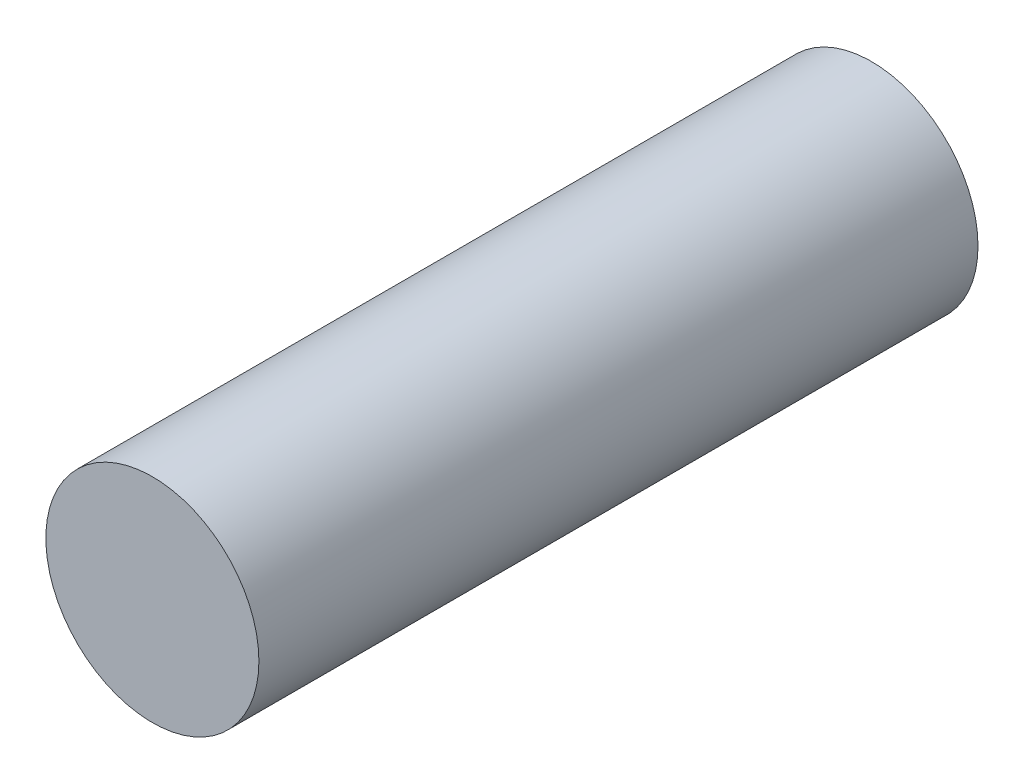
ISO-10303-21;
HEADER;
FILE_DESCRIPTION(('STEP AP214'),'2;1');
FILE_NAME('part.step','',(''),(''),'','','');
FILE_SCHEMA(('AUTOMOTIVE_DESIGN { 1 0 10303 214 1 1 1 1 }'));
ENDSEC;
DATA;
#1=APPLICATION_CONTEXT('core data for automotive mechanical design processes');
#2=APPLICATION_PROTOCOL_DEFINITION('international standard','automotive_design',2000,#1);
#3=PRODUCT_CONTEXT('',#1,'mechanical');
#4=PRODUCT('Part','Part','',(#3));
#5=PRODUCT_RELATED_PRODUCT_CATEGORY('part','',(#4));
#6=PRODUCT_DEFINITION_FORMATION('','',#4);
#7=PRODUCT_DEFINITION_CONTEXT('part definition',#1,'design');
#8=PRODUCT_DEFINITION('design','',#6,#7);
#9=PRODUCT_DEFINITION_SHAPE('','',#8);
#10=(LENGTH_UNIT() NAMED_UNIT(*) SI_UNIT(.MILLI.,.METRE.));
#11=(NAMED_UNIT(*) PLANE_ANGLE_UNIT() SI_UNIT($,.RADIAN.));
#12=(NAMED_UNIT(*) SI_UNIT($,.STERADIAN.) SOLID_ANGLE_UNIT());
#13=UNCERTAINTY_MEASURE_WITH_UNIT(LENGTH_MEASURE(1.E-05),#10,'distance_accuracy_value','');
#14=(GEOMETRIC_REPRESENTATION_CONTEXT(3) GLOBAL_UNCERTAINTY_ASSIGNED_CONTEXT((#13)) GLOBAL_UNIT_ASSIGNED_CONTEXT((#10,
#11,#12)) REPRESENTATION_CONTEXT('',''));
#15=CARTESIAN_POINT('',(0.,0.,0.));
#16=DIRECTION('',(0.,0.,1.));
#17=DIRECTION('',(1.,0.,0.));
#18=AXIS2_PLACEMENT_3D('',#15,#16,#17);
#19=CARTESIAN_POINT('',(0.,0.,27.));
#20=DIRECTION('',(0.,0.,-1.));
#21=DIRECTION('',(-1.,0.,0.));
#22=AXIS2_PLACEMENT_3D('',#19,#20,#21);
#23=CYLINDRICAL_SURFACE('',#22,4.);
#24=CARTESIAN_POINT('',(0.,0.,27.));
#25=DIRECTION('',(0.,0.,1.));
#26=DIRECTION('',(1.,0.,0.));
#27=AXIS2_PLACEMENT_3D('',#24,#25,#26);
#28=CIRCLE('',#27,4.);
#29=CARTESIAN_POINT('',(4.,0.,27.));
#30=VERTEX_POINT('',#29);
#31=EDGE_CURVE('E10',#30,#30,#28,.T.);
#32=ORIENTED_EDGE('',*,*,#31,.F.);
#33=EDGE_LOOP('',(#32));
#34=FACE_BOUND('',#33,.T.);
#35=CARTESIAN_POINT('',(0.,0.,0.));
#36=DIRECTION('',(0.,0.,1.));
#37=DIRECTION('',(1.,0.,0.));
#38=AXIS2_PLACEMENT_3D('',#35,#36,#37);
#39=CIRCLE('',#38,4.);
#40=CARTESIAN_POINT('',(4.,0.,0.));
#41=VERTEX_POINT('',#40);
#42=EDGE_CURVE('E36',#41,#41,#39,.T.);
#43=ORIENTED_EDGE('',*,*,#42,.T.);
#44=EDGE_LOOP('',(#43));
#45=FACE_BOUND('',#44,.T.);
#46=ADVANCED_FACE('F33',(#34,#45),#23,.T.);
#47=CARTESIAN_POINT('',(0.,0.,27.));
#48=DIRECTION('',(0.,0.,1.));
#49=DIRECTION('',(1.,0.,0.));
#50=AXIS2_PLACEMENT_3D('',#47,#48,#49);
#51=PLANE('',#50);
#52=ORIENTED_EDGE('',*,*,#31,.T.);
#53=EDGE_LOOP('',(#52));
#54=FACE_BOUND('',#53,.T.);
#55=ADVANCED_FACE('F48',(#54),#51,.T.);
#56=CARTESIAN_POINT('',(0.,0.,0.));
#57=DIRECTION('',(0.,0.,1.));
#58=DIRECTION('',(1.,0.,0.));
#59=AXIS2_PLACEMENT_3D('',#56,#57,#58);
#60=PLANE('',#59);
#61=ORIENTED_EDGE('',*,*,#42,.F.);
#62=EDGE_LOOP('',(#61));
#63=FACE_BOUND('',#62,.T.);
#64=ADVANCED_FACE('F46',(#63),#60,.F.);
#65=CLOSED_SHELL('',(#46,#55,#64));
#66=MANIFOLD_SOLID_BREP('B2',#65);
#67=ADVANCED_BREP_SHAPE_REPRESENTATION('',(#18,#66),#14);
#68=SHAPE_DEFINITION_REPRESENTATION(#9,#67);
ENDSEC;
END-ISO-10303-21;
